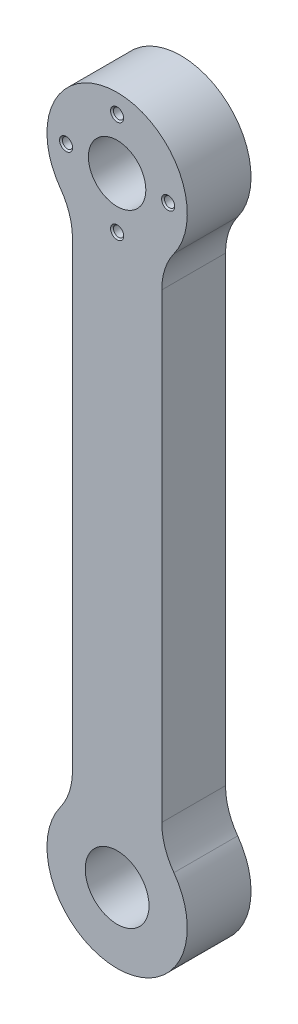
ISO-10303-21;
HEADER;
FILE_DESCRIPTION(('STEP AP214'),'2;1');
FILE_NAME('part.step','',(''),(''),'','','');
FILE_SCHEMA(('AUTOMOTIVE_DESIGN { 1 0 10303 214 1 1 1 1 }'));
ENDSEC;
DATA;
#1=APPLICATION_CONTEXT('core data for automotive mechanical design processes');
#2=APPLICATION_PROTOCOL_DEFINITION('international standard','automotive_design',2000,#1);
#3=PRODUCT_CONTEXT('',#1,'mechanical');
#4=PRODUCT('Part','Part','',(#3));
#5=PRODUCT_RELATED_PRODUCT_CATEGORY('part','',(#4));
#6=PRODUCT_DEFINITION_FORMATION('','',#4);
#7=PRODUCT_DEFINITION_CONTEXT('part definition',#1,'design');
#8=PRODUCT_DEFINITION('design','',#6,#7);
#9=PRODUCT_DEFINITION_SHAPE('','',#8);
#10=(LENGTH_UNIT() NAMED_UNIT(*) SI_UNIT(.MILLI.,.METRE.));
#11=(NAMED_UNIT(*) PLANE_ANGLE_UNIT() SI_UNIT($,.RADIAN.));
#12=(NAMED_UNIT(*) SI_UNIT($,.STERADIAN.) SOLID_ANGLE_UNIT());
#13=UNCERTAINTY_MEASURE_WITH_UNIT(LENGTH_MEASURE(1.E-05),#10,'distance_accuracy_value','');
#14=(GEOMETRIC_REPRESENTATION_CONTEXT(3) GLOBAL_UNCERTAINTY_ASSIGNED_CONTEXT((#13)) GLOBAL_UNIT_ASSIGNED_CONTEXT((#10,
#11,#12)) REPRESENTATION_CONTEXT('',''));
#15=CARTESIAN_POINT('',(0.,0.,0.));
#16=DIRECTION('',(0.,0.,1.));
#17=DIRECTION('',(1.,0.,0.));
#18=AXIS2_PLACEMENT_3D('',#15,#16,#17);
#19=CARTESIAN_POINT('',(0.,48.4852813742386,10.));
#20=DIRECTION('',(0.,0.,1.));
#21=DIRECTION('',(1.,0.,0.));
#22=AXIS2_PLACEMENT_3D('',#19,#20,#21);
#23=PLANE('',#22);
#24=CARTESIAN_POINT('',(0.,-48.4852813742386,10.));
#25=DIRECTION('',(0.,0.,1.));
#26=DIRECTION('',(1.,0.,0.));
#27=AXIS2_PLACEMENT_3D('',#24,#25,#26);
#28=CIRCLE('',#27,5.);
#29=CARTESIAN_POINT('',(5.,-48.4852813742386,10.));
#30=VERTEX_POINT('',#29);
#31=EDGE_CURVE('E395',#30,#30,#28,.T.);
#32=ORIENTED_EDGE('',*,*,#31,.F.);
#33=EDGE_LOOP('',(#32));
#34=FACE_BOUND('',#33,.T.);
#35=CARTESIAN_POINT('',(0.,56.4852813742386,10.));
#36=DIRECTION('',(0.,0.,1.));
#37=DIRECTION('',(1.,0.,0.));
#38=AXIS2_PLACEMENT_3D('',#35,#36,#37);
#39=CIRCLE('',#38,1.025);
#40=CARTESIAN_POINT('',(1.025,56.4852813742386,10.));
#41=VERTEX_POINT('',#40);
#42=EDGE_CURVE('E389',#41,#41,#39,.T.);
#43=ORIENTED_EDGE('',*,*,#42,.F.);
#44=EDGE_LOOP('',(#43));
#45=FACE_BOUND('',#44,.T.);
#46=CARTESIAN_POINT('',(8.,48.4852813742386,10.));
#47=DIRECTION('',(0.,0.,1.));
#48=DIRECTION('',(1.,0.,0.));
#49=AXIS2_PLACEMENT_3D('',#46,#47,#48);
#50=CIRCLE('',#49,1.025);
#51=CARTESIAN_POINT('',(9.025,48.4852813742386,10.));
#52=VERTEX_POINT('',#51);
#53=EDGE_CURVE('E401',#52,#52,#50,.T.);
#54=ORIENTED_EDGE('',*,*,#53,.F.);
#55=EDGE_LOOP('',(#54));
#56=FACE_BOUND('',#55,.T.);
#57=CARTESIAN_POINT('',(0.,40.4852813742386,10.));
#58=DIRECTION('',(0.,0.,1.));
#59=DIRECTION('',(1.,0.,0.));
#60=AXIS2_PLACEMENT_3D('',#57,#58,#59);
#61=CIRCLE('',#60,1.025);
#62=CARTESIAN_POINT('',(1.025,40.4852813742386,10.));
#63=VERTEX_POINT('',#62);
#64=EDGE_CURVE('E410',#63,#63,#61,.T.);
#65=ORIENTED_EDGE('',*,*,#64,.F.);
#66=EDGE_LOOP('',(#65));
#67=FACE_BOUND('',#66,.T.);
#68=CARTESIAN_POINT('',(-8.,48.4852813742386,10.));
#69=DIRECTION('',(0.,0.,1.));
#70=DIRECTION('',(1.,0.,0.));
#71=AXIS2_PLACEMENT_3D('',#68,#69,#70);
#72=CIRCLE('',#71,1.025);
#73=CARTESIAN_POINT('',(-6.975,48.4852813742386,10.));
#74=VERTEX_POINT('',#73);
#75=EDGE_CURVE('E419',#74,#74,#72,.T.);
#76=ORIENTED_EDGE('',*,*,#75,.F.);
#77=EDGE_LOOP('',(#76));
#78=FACE_BOUND('',#77,.T.);
#79=DIRECTION('',(0.,1.,0.));
#80=VECTOR('',#79,1.);
#81=CARTESIAN_POINT('',(6.99999999999999,40.,10.));
#82=LINE('',#81,#80);
#83=CARTESIAN_POINT('',(6.99999999999999,-36.1564533683006,10.));
#84=VERTEX_POINT('',#83);
#85=CARTESIAN_POINT('',(6.99999999999999,36.1564533683006,10.));
#86=VERTEX_POINT('',#85);
#87=EDGE_CURVE('E152',#84,#86,#82,.T.);
#88=ORIENTED_EDGE('',*,*,#87,.T.);
#89=CARTESIAN_POINT('',(17.,36.1564533683006,10.));
#90=DIRECTION('',(0.,0.,1.));
#91=DIRECTION('',(1.,0.,0.));
#92=AXIS2_PLACEMENT_3D('',#89,#90,#91);
#93=CIRCLE('',#92,10.);
#94=CARTESIAN_POINT('',(8.9047619047619,42.0273238473187,10.));
#95=VERTEX_POINT('',#94);
#96=EDGE_CURVE('E69',#86,#95,#93,.F.);
#97=ORIENTED_EDGE('',*,*,#96,.T.);
#98=CARTESIAN_POINT('',(0.,48.4852813742386,10.));
#99=DIRECTION('',(0.,0.,1.));
#100=DIRECTION('',(1.,0.,0.));
#101=AXIS2_PLACEMENT_3D('',#98,#99,#100);
#102=CIRCLE('',#101,11.);
#103=CARTESIAN_POINT('',(-8.9047619047619,42.0273238473187,10.));
#104=VERTEX_POINT('',#103);
#105=EDGE_CURVE('E146',#95,#104,#102,.T.);
#106=ORIENTED_EDGE('',*,*,#105,.T.);
#107=CARTESIAN_POINT('',(-17.,36.1564533683006,10.));
#108=DIRECTION('',(0.,0.,1.));
#109=DIRECTION('',(1.,0.,0.));
#110=AXIS2_PLACEMENT_3D('',#107,#108,#109);
#111=CIRCLE('',#110,10.);
#112=CARTESIAN_POINT('',(-6.99999999999999,36.1564533683006,10.));
#113=VERTEX_POINT('',#112);
#114=EDGE_CURVE('E11',#104,#113,#111,.F.);
#115=ORIENTED_EDGE('',*,*,#114,.T.);
#116=DIRECTION('',(0.,-1.,0.));
#117=VECTOR('',#116,1.);
#118=CARTESIAN_POINT('',(-6.99999999999999,40.,10.));
#119=LINE('',#118,#117);
#120=CARTESIAN_POINT('',(-6.99999999999999,-36.1564533683006,10.));
#121=VERTEX_POINT('',#120);
#122=EDGE_CURVE('E180',#113,#121,#119,.T.);
#123=ORIENTED_EDGE('',*,*,#122,.T.);
#124=CARTESIAN_POINT('',(-17.,-36.1564533683006,10.));
#125=DIRECTION('',(0.,0.,1.));
#126=DIRECTION('',(1.,0.,0.));
#127=AXIS2_PLACEMENT_3D('',#124,#125,#126);
#128=CIRCLE('',#127,10.);
#129=CARTESIAN_POINT('',(-8.9047619047619,-42.0273238473187,10.));
#130=VERTEX_POINT('',#129);
#131=EDGE_CURVE('E123',#121,#130,#128,.F.);
#132=ORIENTED_EDGE('',*,*,#131,.T.);
#133=CARTESIAN_POINT('',(0.,-48.4852813742386,10.));
#134=DIRECTION('',(0.,0.,1.));
#135=DIRECTION('',(-1.,0.,0.));
#136=AXIS2_PLACEMENT_3D('',#133,#134,#135);
#137=CIRCLE('',#136,11.);
#138=CARTESIAN_POINT('',(8.90476190476191,-42.0273238473187,10.));
#139=VERTEX_POINT('',#138);
#140=EDGE_CURVE('E133',#130,#139,#137,.T.);
#141=ORIENTED_EDGE('',*,*,#140,.T.);
#142=CARTESIAN_POINT('',(17.,-36.1564533683006,10.));
#143=DIRECTION('',(0.,0.,1.));
#144=DIRECTION('',(1.,0.,0.));
#145=AXIS2_PLACEMENT_3D('',#142,#143,#144);
#146=CIRCLE('',#145,10.);
#147=EDGE_CURVE('E167',#139,#84,#146,.F.);
#148=ORIENTED_EDGE('',*,*,#147,.T.);
#149=EDGE_LOOP('',(#88,#97,#106,#115,#123,#132,#141,#148));
#150=FACE_BOUND('',#149,.T.);
#151=CARTESIAN_POINT('',(0.,48.4852813742386,10.));
#152=DIRECTION('',(0.,0.,1.));
#153=DIRECTION('',(1.,0.,0.));
#154=AXIS2_PLACEMENT_3D('',#151,#152,#153);
#155=CIRCLE('',#154,4.50263545763704);
#156=CARTESIAN_POINT('',(4.50263545763704,48.4852813742386,10.));
#157=VERTEX_POINT('',#156);
#158=EDGE_CURVE('E175',#157,#157,#155,.T.);
#159=ORIENTED_EDGE('',*,*,#158,.F.);
#160=EDGE_LOOP('',(#159));
#161=FACE_BOUND('',#160,.T.);
#162=ADVANCED_FACE('F47',(#34,#45,#56,#67,#78,#150,#161),#23,.T.);
#163=CARTESIAN_POINT('',(0.,48.4852813742386,0.));
#164=DIRECTION('',(0.,0.,1.));
#165=DIRECTION('',(1.,0.,0.));
#166=AXIS2_PLACEMENT_3D('',#163,#164,#165);
#167=PLANE('',#166);
#168=CARTESIAN_POINT('',(0.,-48.4852813742386,0.));
#169=DIRECTION('',(0.,0.,1.));
#170=DIRECTION('',(1.,0.,0.));
#171=AXIS2_PLACEMENT_3D('',#168,#169,#170);
#172=CIRCLE('',#171,5.);
#173=CARTESIAN_POINT('',(5.,-48.4852813742386,0.));
#174=VERTEX_POINT('',#173);
#175=EDGE_CURVE('E390',#174,#174,#172,.T.);
#176=ORIENTED_EDGE('',*,*,#175,.T.);
#177=EDGE_LOOP('',(#176));
#178=FACE_BOUND('',#177,.T.);
#179=CARTESIAN_POINT('',(0.,56.4852813742386,0.));
#180=DIRECTION('',(0.,0.,1.));
#181=DIRECTION('',(1.,0.,0.));
#182=AXIS2_PLACEMENT_3D('',#179,#180,#181);
#183=CIRCLE('',#182,0.799999999999998);
#184=CARTESIAN_POINT('',(0.799999999999998,56.4852813742386,0.));
#185=VERTEX_POINT('',#184);
#186=EDGE_CURVE('E392',#185,#185,#183,.T.);
#187=ORIENTED_EDGE('',*,*,#186,.T.);
#188=EDGE_LOOP('',(#187));
#189=FACE_BOUND('',#188,.T.);
#190=CARTESIAN_POINT('',(8.,48.4852813742386,0.));
#191=DIRECTION('',(0.,0.,1.));
#192=DIRECTION('',(1.,0.,0.));
#193=AXIS2_PLACEMENT_3D('',#190,#191,#192);
#194=CIRCLE('',#193,0.799999999999999);
#195=CARTESIAN_POINT('',(8.8,48.4852813742386,0.));
#196=VERTEX_POINT('',#195);
#197=EDGE_CURVE('E407',#196,#196,#194,.T.);
#198=ORIENTED_EDGE('',*,*,#197,.T.);
#199=EDGE_LOOP('',(#198));
#200=FACE_BOUND('',#199,.T.);
#201=CARTESIAN_POINT('',(0.,40.4852813742386,0.));
#202=DIRECTION('',(0.,0.,1.));
#203=DIRECTION('',(1.,0.,0.));
#204=AXIS2_PLACEMENT_3D('',#201,#202,#203);
#205=CIRCLE('',#204,0.799999999999998);
#206=CARTESIAN_POINT('',(0.799999999999998,40.4852813742386,0.));
#207=VERTEX_POINT('',#206);
#208=EDGE_CURVE('E416',#207,#207,#205,.T.);
#209=ORIENTED_EDGE('',*,*,#208,.T.);
#210=EDGE_LOOP('',(#209));
#211=FACE_BOUND('',#210,.T.);
#212=CARTESIAN_POINT('',(-8.,48.4852813742386,0.));
#213=DIRECTION('',(0.,0.,1.));
#214=DIRECTION('',(1.,0.,0.));
#215=AXIS2_PLACEMENT_3D('',#212,#213,#214);
#216=CIRCLE('',#215,0.799999999999998);
#217=CARTESIAN_POINT('',(-7.2,48.4852813742386,0.));
#218=VERTEX_POINT('',#217);
#219=EDGE_CURVE('E425',#218,#218,#216,.T.);
#220=ORIENTED_EDGE('',*,*,#219,.T.);
#221=EDGE_LOOP('',(#220));
#222=FACE_BOUND('',#221,.T.);
#223=CARTESIAN_POINT('',(0.,48.4852813742386,0.));
#224=DIRECTION('',(0.,0.,1.));
#225=DIRECTION('',(1.,0.,0.));
#226=AXIS2_PLACEMENT_3D('',#223,#224,#225);
#227=CIRCLE('',#226,11.);
#228=CARTESIAN_POINT('',(8.9047619047619,42.0273238473187,0.));
#229=VERTEX_POINT('',#228);
#230=CARTESIAN_POINT('',(-8.9047619047619,42.0273238473187,0.));
#231=VERTEX_POINT('',#230);
#232=EDGE_CURVE('E148',#229,#231,#227,.T.);
#233=ORIENTED_EDGE('',*,*,#232,.F.);
#234=CARTESIAN_POINT('',(17.,36.1564533683006,0.));
#235=DIRECTION('',(0.,0.,1.));
#236=DIRECTION('',(1.,0.,0.));
#237=AXIS2_PLACEMENT_3D('',#234,#235,#236);
#238=CIRCLE('',#237,10.);
#239=CARTESIAN_POINT('',(6.99999999999999,36.1564533683006,0.));
#240=VERTEX_POINT('',#239);
#241=EDGE_CURVE('E169',#229,#240,#238,.T.);
#242=ORIENTED_EDGE('',*,*,#241,.T.);
#243=DIRECTION('',(0.,1.,0.));
#244=VECTOR('',#243,1.);
#245=CARTESIAN_POINT('',(6.99999999999999,40.,0.));
#246=LINE('',#245,#244);
#247=CARTESIAN_POINT('',(6.99999999999999,-36.1564533683006,0.));
#248=VERTEX_POINT('',#247);
#249=EDGE_CURVE('E142',#248,#240,#246,.T.);
#250=ORIENTED_EDGE('',*,*,#249,.F.);
#251=CARTESIAN_POINT('',(17.,-36.1564533683006,0.));
#252=DIRECTION('',(0.,0.,1.));
#253=DIRECTION('',(1.,0.,0.));
#254=AXIS2_PLACEMENT_3D('',#251,#252,#253);
#255=CIRCLE('',#254,10.);
#256=CARTESIAN_POINT('',(8.90476190476191,-42.0273238473187,0.));
#257=VERTEX_POINT('',#256);
#258=EDGE_CURVE('E141',#248,#257,#255,.T.);
#259=ORIENTED_EDGE('',*,*,#258,.T.);
#260=CARTESIAN_POINT('',(0.,-48.4852813742386,0.));
#261=DIRECTION('',(0.,0.,1.));
#262=DIRECTION('',(-1.,0.,0.));
#263=AXIS2_PLACEMENT_3D('',#260,#261,#262);
#264=CIRCLE('',#263,11.);
#265=CARTESIAN_POINT('',(-8.9047619047619,-42.0273238473187,0.));
#266=VERTEX_POINT('',#265);
#267=EDGE_CURVE('E130',#266,#257,#264,.T.);
#268=ORIENTED_EDGE('',*,*,#267,.F.);
#269=CARTESIAN_POINT('',(-17.,-36.1564533683006,0.));
#270=DIRECTION('',(0.,0.,1.));
#271=DIRECTION('',(1.,0.,0.));
#272=AXIS2_PLACEMENT_3D('',#269,#270,#271);
#273=CIRCLE('',#272,10.);
#274=CARTESIAN_POINT('',(-6.99999999999999,-36.1564533683006,0.));
#275=VERTEX_POINT('',#274);
#276=EDGE_CURVE('E113',#266,#275,#273,.T.);
#277=ORIENTED_EDGE('',*,*,#276,.T.);
#278=DIRECTION('',(0.,-1.,0.));
#279=VECTOR('',#278,1.);
#280=CARTESIAN_POINT('',(-6.99999999999999,40.,0.));
#281=LINE('',#280,#279);
#282=CARTESIAN_POINT('',(-6.99999999999999,36.1564533683006,0.));
#283=VERTEX_POINT('',#282);
#284=EDGE_CURVE('E143',#283,#275,#281,.T.);
#285=ORIENTED_EDGE('',*,*,#284,.F.);
#286=CARTESIAN_POINT('',(-17.,36.1564533683006,0.));
#287=DIRECTION('',(0.,0.,1.));
#288=DIRECTION('',(1.,0.,0.));
#289=AXIS2_PLACEMENT_3D('',#286,#287,#288);
#290=CIRCLE('',#289,10.);
#291=EDGE_CURVE('E55',#283,#231,#290,.T.);
#292=ORIENTED_EDGE('',*,*,#291,.T.);
#293=EDGE_LOOP('',(#233,#242,#250,#259,#268,#277,#285,#292));
#294=FACE_BOUND('',#293,.T.);
#295=CARTESIAN_POINT('',(0.,48.4852813742386,0.));
#296=DIRECTION('',(0.,0.,1.));
#297=DIRECTION('',(1.,0.,0.));
#298=AXIS2_PLACEMENT_3D('',#295,#296,#297);
#299=CIRCLE('',#298,4.50263545763704);
#300=CARTESIAN_POINT('',(4.50263545763704,48.4852813742386,0.));
#301=VERTEX_POINT('',#300);
#302=EDGE_CURVE('E428',#301,#301,#299,.T.);
#303=ORIENTED_EDGE('',*,*,#302,.T.);
#304=EDGE_LOOP('',(#303));
#305=FACE_BOUND('',#304,.T.);
#306=ADVANCED_FACE('F138',(#178,#189,#200,#211,#222,#294,#305),#167,.F.);
#307=CARTESIAN_POINT('',(0.,48.4852813742386,10.));
#308=DIRECTION('',(0.,0.,-1.));
#309=DIRECTION('',(-1.,0.,0.));
#310=AXIS2_PLACEMENT_3D('',#307,#308,#309);
#311=CYLINDRICAL_SURFACE('',#310,11.);
#312=ORIENTED_EDGE('',*,*,#105,.F.);
#313=DIRECTION('',(0.,0.,-1.));
#314=VECTOR('',#313,1.);
#315=CARTESIAN_POINT('',(8.9047619047619,42.0273238473187,10.));
#316=LINE('',#315,#314);
#317=EDGE_CURVE('E124',#95,#229,#316,.T.);
#318=ORIENTED_EDGE('',*,*,#317,.T.);
#319=ORIENTED_EDGE('',*,*,#232,.T.);
#320=DIRECTION('',(0.,0.,-1.));
#321=VECTOR('',#320,1.);
#322=CARTESIAN_POINT('',(-8.9047619047619,42.0273238473187,10.));
#323=LINE('',#322,#321);
#324=EDGE_CURVE('E62',#231,#104,#323,.F.);
#325=ORIENTED_EDGE('',*,*,#324,.T.);
#326=EDGE_LOOP('',(#312,#318,#319,#325));
#327=FACE_BOUND('',#326,.T.);
#328=ADVANCED_FACE('F173',(#327),#311,.T.);
#329=CARTESIAN_POINT('',(-6.99999999999999,40.,10.));
#330=DIRECTION('',(1.,0.,0.));
#331=DIRECTION('',(0.,1.,0.));
#332=AXIS2_PLACEMENT_3D('',#329,#330,#331);
#333=PLANE('',#332);
#334=ORIENTED_EDGE('',*,*,#284,.T.);
#335=DIRECTION('',(0.,0.,1.));
#336=VECTOR('',#335,1.);
#337=CARTESIAN_POINT('',(-6.99999999999999,-36.1564533683006,10.));
#338=LINE('',#337,#336);
#339=EDGE_CURVE('E118',#275,#121,#338,.T.);
#340=ORIENTED_EDGE('',*,*,#339,.T.);
#341=ORIENTED_EDGE('',*,*,#122,.F.);
#342=DIRECTION('',(0.,0.,1.));
#343=VECTOR('',#342,1.);
#344=CARTESIAN_POINT('',(-6.99999999999999,36.1564533683006,0.));
#345=LINE('',#344,#343);
#346=EDGE_CURVE('E134',#113,#283,#345,.F.);
#347=ORIENTED_EDGE('',*,*,#346,.T.);
#348=EDGE_LOOP('',(#334,#340,#341,#347));
#349=FACE_BOUND('',#348,.T.);
#350=ADVANCED_FACE('F182',(#349),#333,.F.);
#351=CARTESIAN_POINT('',(0.,-48.4852813742386,10.));
#352=DIRECTION('',(0.,0.,-1.));
#353=DIRECTION('',(-1.,0.,0.));
#354=AXIS2_PLACEMENT_3D('',#351,#352,#353);
#355=CYLINDRICAL_SURFACE('',#354,11.);
#356=ORIENTED_EDGE('',*,*,#140,.F.);
#357=DIRECTION('',(0.,0.,-1.));
#358=VECTOR('',#357,1.);
#359=CARTESIAN_POINT('',(-8.90476190476191,-42.0273238473187,10.));
#360=LINE('',#359,#358);
#361=EDGE_CURVE('E117',#130,#266,#360,.T.);
#362=ORIENTED_EDGE('',*,*,#361,.T.);
#363=ORIENTED_EDGE('',*,*,#267,.T.);
#364=DIRECTION('',(0.,0.,-1.));
#365=VECTOR('',#364,1.);
#366=CARTESIAN_POINT('',(8.90476190476191,-42.0273238473187,10.));
#367=LINE('',#366,#365);
#368=EDGE_CURVE('E135',#257,#139,#367,.F.);
#369=ORIENTED_EDGE('',*,*,#368,.T.);
#370=EDGE_LOOP('',(#356,#362,#363,#369));
#371=FACE_BOUND('',#370,.T.);
#372=ADVANCED_FACE('F129',(#371),#355,.T.);
#373=CARTESIAN_POINT('',(6.99999999999999,40.,10.));
#374=DIRECTION('',(-1.,0.,0.));
#375=DIRECTION('',(0.,0.,1.));
#376=AXIS2_PLACEMENT_3D('',#373,#374,#375);
#377=PLANE('',#376);
#378=ORIENTED_EDGE('',*,*,#87,.F.);
#379=DIRECTION('',(0.,0.,1.));
#380=VECTOR('',#379,1.);
#381=CARTESIAN_POINT('',(6.99999999999999,-36.1564533683006,0.));
#382=LINE('',#381,#380);
#383=EDGE_CURVE('E159',#84,#248,#382,.F.);
#384=ORIENTED_EDGE('',*,*,#383,.T.);
#385=ORIENTED_EDGE('',*,*,#249,.T.);
#386=DIRECTION('',(0.,0.,1.));
#387=VECTOR('',#386,1.);
#388=CARTESIAN_POINT('',(6.99999999999999,36.1564533683006,10.));
#389=LINE('',#388,#387);
#390=EDGE_CURVE('E157',#240,#86,#389,.T.);
#391=ORIENTED_EDGE('',*,*,#390,.T.);
#392=EDGE_LOOP('',(#378,#384,#385,#391));
#393=FACE_BOUND('',#392,.T.);
#394=ADVANCED_FACE('F195',(#393),#377,.F.);
#395=CARTESIAN_POINT('',(0.,48.4852813742386,10.));
#396=DIRECTION('',(0.,0.,-1.));
#397=DIRECTION('',(-1.,0.,0.));
#398=AXIS2_PLACEMENT_3D('',#395,#396,#397);
#399=CYLINDRICAL_SURFACE('',#398,4.50263545763704);
#400=ORIENTED_EDGE('',*,*,#158,.T.);
#401=EDGE_LOOP('',(#400));
#402=FACE_BOUND('',#401,.T.);
#403=ORIENTED_EDGE('',*,*,#302,.F.);
#404=EDGE_LOOP('',(#403));
#405=FACE_BOUND('',#404,.T.);
#406=ADVANCED_FACE('F218',(#402,#405),#399,.F.);
#407=CARTESIAN_POINT('',(-8.,48.4852813742386,10.));
#408=DIRECTION('',(0.,0.,1.));
#409=DIRECTION('',(1.,0.,0.));
#410=AXIS2_PLACEMENT_3D('',#407,#408,#409);
#411=CYLINDRICAL_SURFACE('',#410,0.799999999999993);
#412=ORIENTED_EDGE('',*,*,#219,.F.);
#413=EDGE_LOOP('',(#412));
#414=FACE_BOUND('',#413,.T.);
#415=CARTESIAN_POINT('',(-8.,48.4852813742386,9.775));
#416=DIRECTION('',(0.,0.,1.));
#417=DIRECTION('',(1.,0.,0.));
#418=AXIS2_PLACEMENT_3D('',#415,#416,#417);
#419=CIRCLE('',#418,0.799999999999988);
#420=CARTESIAN_POINT('',(-7.20000000000001,48.4852813742386,9.775));
#421=VERTEX_POINT('',#420);
#422=EDGE_CURVE('E422',#421,#421,#419,.T.);
#423=ORIENTED_EDGE('',*,*,#422,.T.);
#424=EDGE_LOOP('',(#423));
#425=FACE_BOUND('',#424,.T.);
#426=ADVANCED_FACE('F308',(#414,#425),#411,.F.);
#427=CARTESIAN_POINT('',(-8.,48.4852813742386,10.));
#428=DIRECTION('',(0.,0.,1.));
#429=DIRECTION('',(1.,0.,0.));
#430=AXIS2_PLACEMENT_3D('',#427,#428,#429);
#431=CONICAL_SURFACE('',#430,1.025,0.785398163397464);
#432=ORIENTED_EDGE('',*,*,#422,.F.);
#433=EDGE_LOOP('',(#432));
#434=FACE_BOUND('',#433,.T.);
#435=ORIENTED_EDGE('',*,*,#75,.T.);
#436=EDGE_LOOP('',(#435));
#437=FACE_BOUND('',#436,.T.);
#438=ADVANCED_FACE('F316',(#434,#437),#431,.F.);
#439=CARTESIAN_POINT('',(0.,40.4852813742386,10.));
#440=DIRECTION('',(0.,0.,1.));
#441=DIRECTION('',(1.,0.,0.));
#442=AXIS2_PLACEMENT_3D('',#439,#440,#441);
#443=CYLINDRICAL_SURFACE('',#442,0.799999999999993);
#444=ORIENTED_EDGE('',*,*,#208,.F.);
#445=EDGE_LOOP('',(#444));
#446=FACE_BOUND('',#445,.T.);
#447=CARTESIAN_POINT('',(0.,40.4852813742386,9.775));
#448=DIRECTION('',(0.,0.,1.));
#449=DIRECTION('',(1.,0.,0.));
#450=AXIS2_PLACEMENT_3D('',#447,#448,#449);
#451=CIRCLE('',#450,0.799999999999988);
#452=CARTESIAN_POINT('',(0.799999999999988,40.4852813742386,9.775));
#453=VERTEX_POINT('',#452);
#454=EDGE_CURVE('E413',#453,#453,#451,.T.);
#455=ORIENTED_EDGE('',*,*,#454,.T.);
#456=EDGE_LOOP('',(#455));
#457=FACE_BOUND('',#456,.T.);
#458=ADVANCED_FACE('F325',(#446,#457),#443,.F.);
#459=CARTESIAN_POINT('',(0.,40.4852813742386,10.));
#460=DIRECTION('',(0.,0.,1.));
#461=DIRECTION('',(1.,0.,0.));
#462=AXIS2_PLACEMENT_3D('',#459,#460,#461);
#463=CONICAL_SURFACE('',#462,1.025,0.785398163397464);
#464=ORIENTED_EDGE('',*,*,#454,.F.);
#465=EDGE_LOOP('',(#464));
#466=FACE_BOUND('',#465,.T.);
#467=ORIENTED_EDGE('',*,*,#64,.T.);
#468=EDGE_LOOP('',(#467));
#469=FACE_BOUND('',#468,.T.);
#470=ADVANCED_FACE('F335',(#466,#469),#463,.F.);
#471=CARTESIAN_POINT('',(8.,48.4852813742386,10.));
#472=DIRECTION('',(0.,0.,1.));
#473=DIRECTION('',(1.,0.,0.));
#474=AXIS2_PLACEMENT_3D('',#471,#472,#473);
#475=CYLINDRICAL_SURFACE('',#474,0.799999999999993);
#476=ORIENTED_EDGE('',*,*,#197,.F.);
#477=EDGE_LOOP('',(#476));
#478=FACE_BOUND('',#477,.T.);
#479=CARTESIAN_POINT('',(8.,48.4852813742386,9.775));
#480=DIRECTION('',(0.,0.,1.));
#481=DIRECTION('',(1.,0.,0.));
#482=AXIS2_PLACEMENT_3D('',#479,#480,#481);
#483=CIRCLE('',#482,0.799999999999988);
#484=CARTESIAN_POINT('',(8.79999999999999,48.4852813742386,9.775));
#485=VERTEX_POINT('',#484);
#486=EDGE_CURVE('E404',#485,#485,#483,.T.);
#487=ORIENTED_EDGE('',*,*,#486,.T.);
#488=EDGE_LOOP('',(#487));
#489=FACE_BOUND('',#488,.T.);
#490=ADVANCED_FACE('F345',(#478,#489),#475,.F.);
#491=CARTESIAN_POINT('',(8.,48.4852813742386,10.));
#492=DIRECTION('',(0.,0.,1.));
#493=DIRECTION('',(1.,0.,0.));
#494=AXIS2_PLACEMENT_3D('',#491,#492,#493);
#495=CONICAL_SURFACE('',#494,1.025,0.785398163397464);
#496=ORIENTED_EDGE('',*,*,#486,.F.);
#497=EDGE_LOOP('',(#496));
#498=FACE_BOUND('',#497,.T.);
#499=ORIENTED_EDGE('',*,*,#53,.T.);
#500=EDGE_LOOP('',(#499));
#501=FACE_BOUND('',#500,.T.);
#502=ADVANCED_FACE('F355',(#498,#501),#495,.F.);
#503=CARTESIAN_POINT('',(0.,56.4852813742386,10.));
#504=DIRECTION('',(0.,0.,1.));
#505=DIRECTION('',(1.,0.,0.));
#506=AXIS2_PLACEMENT_3D('',#503,#504,#505);
#507=CYLINDRICAL_SURFACE('',#506,0.799999999999993);
#508=ORIENTED_EDGE('',*,*,#186,.F.);
#509=EDGE_LOOP('',(#508));
#510=FACE_BOUND('',#509,.T.);
#511=CARTESIAN_POINT('',(0.,56.4852813742386,9.775));
#512=DIRECTION('',(0.,0.,1.));
#513=DIRECTION('',(1.,0.,0.));
#514=AXIS2_PLACEMENT_3D('',#511,#512,#513);
#515=CIRCLE('',#514,0.799999999999988);
#516=CARTESIAN_POINT('',(0.799999999999988,56.4852813742386,9.775));
#517=VERTEX_POINT('',#516);
#518=EDGE_CURVE('E386',#517,#517,#515,.T.);
#519=ORIENTED_EDGE('',*,*,#518,.T.);
#520=EDGE_LOOP('',(#519));
#521=FACE_BOUND('',#520,.T.);
#522=ADVANCED_FACE('F365',(#510,#521),#507,.F.);
#523=CARTESIAN_POINT('',(0.,56.4852813742386,10.));
#524=DIRECTION('',(0.,0.,1.));
#525=DIRECTION('',(1.,0.,0.));
#526=AXIS2_PLACEMENT_3D('',#523,#524,#525);
#527=CONICAL_SURFACE('',#526,1.025,0.785398163397464);
#528=ORIENTED_EDGE('',*,*,#518,.F.);
#529=EDGE_LOOP('',(#528));
#530=FACE_BOUND('',#529,.T.);
#531=ORIENTED_EDGE('',*,*,#42,.T.);
#532=EDGE_LOOP('',(#531));
#533=FACE_BOUND('',#532,.T.);
#534=ADVANCED_FACE('F204',(#530,#533),#527,.F.);
#535=CARTESIAN_POINT('',(-17.,-36.1564533683006,10.));
#536=DIRECTION('',(0.,0.,-1.));
#537=DIRECTION('',(-1.,0.,0.));
#538=AXIS2_PLACEMENT_3D('',#535,#536,#537);
#539=CYLINDRICAL_SURFACE('',#538,10.);
#540=ORIENTED_EDGE('',*,*,#131,.F.);
#541=ORIENTED_EDGE('',*,*,#339,.F.);
#542=ORIENTED_EDGE('',*,*,#276,.F.);
#543=ORIENTED_EDGE('',*,*,#361,.F.);
#544=EDGE_LOOP('',(#540,#541,#542,#543));
#545=FACE_BOUND('',#544,.T.);
#546=ADVANCED_FACE('F116',(#545),#539,.F.);
#547=CARTESIAN_POINT('',(17.,-36.1564533683006,10.));
#548=DIRECTION('',(0.,0.,-1.));
#549=DIRECTION('',(-1.,0.,0.));
#550=AXIS2_PLACEMENT_3D('',#547,#548,#549);
#551=CYLINDRICAL_SURFACE('',#550,10.);
#552=ORIENTED_EDGE('',*,*,#147,.F.);
#553=ORIENTED_EDGE('',*,*,#368,.F.);
#554=ORIENTED_EDGE('',*,*,#258,.F.);
#555=ORIENTED_EDGE('',*,*,#383,.F.);
#556=EDGE_LOOP('',(#552,#553,#554,#555));
#557=FACE_BOUND('',#556,.T.);
#558=ADVANCED_FACE('F197',(#557),#551,.F.);
#559=CARTESIAN_POINT('',(17.,36.1564533683006,10.));
#560=DIRECTION('',(0.,0.,-1.));
#561=DIRECTION('',(-1.,0.,0.));
#562=AXIS2_PLACEMENT_3D('',#559,#560,#561);
#563=CYLINDRICAL_SURFACE('',#562,10.);
#564=ORIENTED_EDGE('',*,*,#96,.F.);
#565=ORIENTED_EDGE('',*,*,#390,.F.);
#566=ORIENTED_EDGE('',*,*,#241,.F.);
#567=ORIENTED_EDGE('',*,*,#317,.F.);
#568=EDGE_LOOP('',(#564,#565,#566,#567));
#569=FACE_BOUND('',#568,.T.);
#570=ADVANCED_FACE('F194',(#569),#563,.F.);
#571=CARTESIAN_POINT('',(-17.,36.1564533683006,10.));
#572=DIRECTION('',(0.,0.,-1.));
#573=DIRECTION('',(-1.,0.,0.));
#574=AXIS2_PLACEMENT_3D('',#571,#572,#573);
#575=CYLINDRICAL_SURFACE('',#574,10.);
#576=ORIENTED_EDGE('',*,*,#114,.F.);
#577=ORIENTED_EDGE('',*,*,#324,.F.);
#578=ORIENTED_EDGE('',*,*,#291,.F.);
#579=ORIENTED_EDGE('',*,*,#346,.F.);
#580=EDGE_LOOP('',(#576,#577,#578,#579));
#581=FACE_BOUND('',#580,.T.);
#582=ADVANCED_FACE('F49',(#581),#575,.F.);
#583=CARTESIAN_POINT('',(0.,-48.4852813742386,0.));
#584=DIRECTION('',(0.,0.,1.));
#585=DIRECTION('',(1.,0.,0.));
#586=AXIS2_PLACEMENT_3D('',#583,#584,#585);
#587=CYLINDRICAL_SURFACE('',#586,5.);
#588=ORIENTED_EDGE('',*,*,#175,.F.);
#589=EDGE_LOOP('',(#588));
#590=FACE_BOUND('',#589,.T.);
#591=ORIENTED_EDGE('',*,*,#31,.T.);
#592=EDGE_LOOP('',(#591));
#593=FACE_BOUND('',#592,.T.);
#594=ADVANCED_FACE('F280',(#590,#593),#587,.F.);
#595=CLOSED_SHELL('',(#162,#306,#328,#350,#372,#394,#406,#426,#438,#458,#470,#490,#502,#522,
#534,#546,#558,#570,#582,#594));
#596=MANIFOLD_SOLID_BREP('B2',#595);
#597=ADVANCED_BREP_SHAPE_REPRESENTATION('',(#18,#596),#14);
#598=SHAPE_DEFINITION_REPRESENTATION(#9,#597);
ENDSEC;
END-ISO-10303-21;
